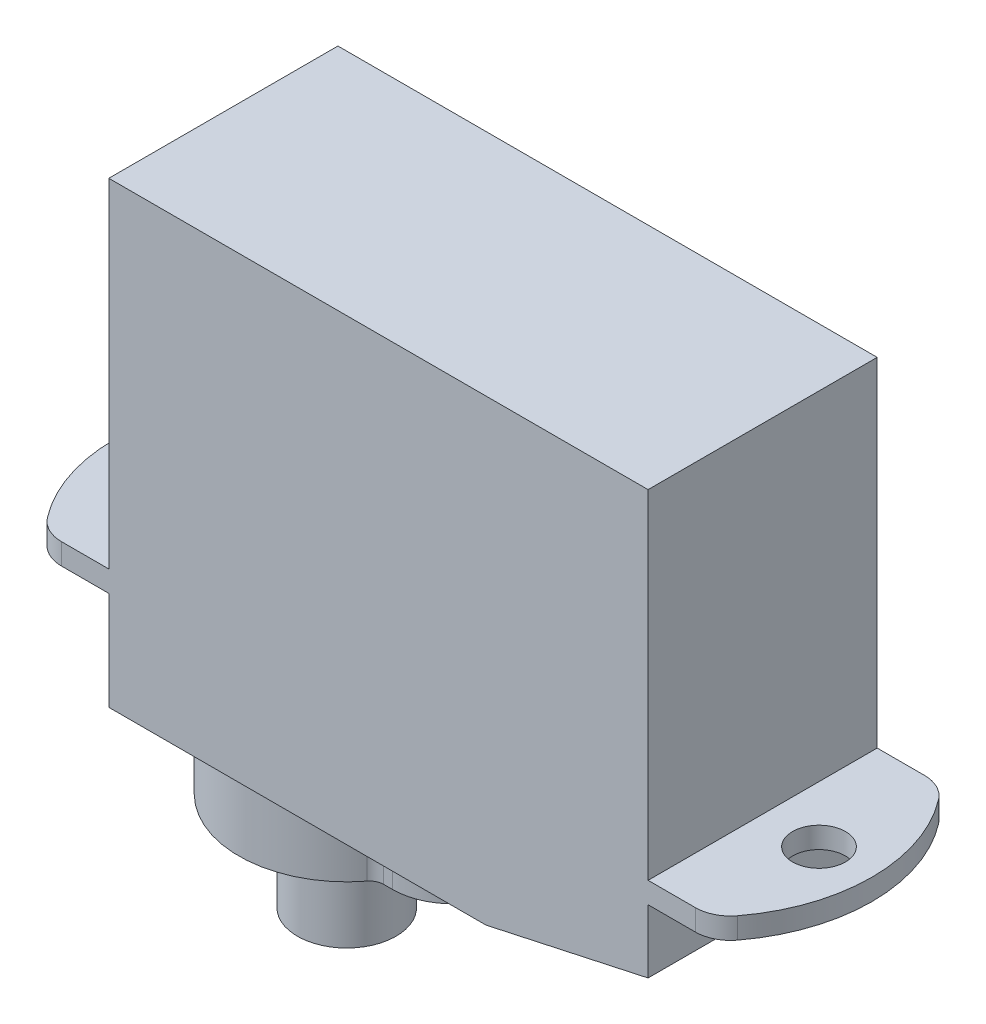
ISO-10303-21;
HEADER;
FILE_DESCRIPTION(('STEP AP214'),'2;1');
FILE_NAME('part.step','',(''),(''),'','','');
FILE_SCHEMA(('AUTOMOTIVE_DESIGN { 1 0 10303 214 1 1 1 1 }'));
ENDSEC;
DATA;
#1=APPLICATION_CONTEXT('core data for automotive mechanical design processes');
#2=APPLICATION_PROTOCOL_DEFINITION('international standard','automotive_design',2000,#1);
#3=PRODUCT_CONTEXT('',#1,'mechanical');
#4=PRODUCT('Part','Part','',(#3));
#5=PRODUCT_RELATED_PRODUCT_CATEGORY('part','',(#4));
#6=PRODUCT_DEFINITION_FORMATION('','',#4);
#7=PRODUCT_DEFINITION_CONTEXT('part definition',#1,'design');
#8=PRODUCT_DEFINITION('design','',#6,#7);
#9=PRODUCT_DEFINITION_SHAPE('','',#8);
#10=(LENGTH_UNIT() NAMED_UNIT(*) SI_UNIT(.MILLI.,.METRE.));
#11=(NAMED_UNIT(*) PLANE_ANGLE_UNIT() SI_UNIT($,.RADIAN.));
#12=(NAMED_UNIT(*) SI_UNIT($,.STERADIAN.) SOLID_ANGLE_UNIT());
#13=UNCERTAINTY_MEASURE_WITH_UNIT(LENGTH_MEASURE(1.E-05),#10,'distance_accuracy_value','');
#14=(GEOMETRIC_REPRESENTATION_CONTEXT(3) GLOBAL_UNCERTAINTY_ASSIGNED_CONTEXT((#13)) GLOBAL_UNIT_ASSIGNED_CONTEXT((#10,
#11,#12)) REPRESENTATION_CONTEXT('',''));
#15=CARTESIAN_POINT('',(0.,0.,0.));
#16=DIRECTION('',(0.,0.,1.));
#17=DIRECTION('',(1.,0.,0.));
#18=AXIS2_PLACEMENT_3D('',#15,#16,#17);
#19=CARTESIAN_POINT('',(-1.77820782436521,-2.54,-2.667));
#20=DIRECTION('',(0.,-1.,0.));
#21=DIRECTION('',(0.,0.,-1.));
#22=AXIS2_PLACEMENT_3D('',#19,#20,#21);
#23=PLANE('',#22);
#24=CARTESIAN_POINT('',(-1.77820782436521,-2.54,-2.667));
#25=DIRECTION('',(0.,1.,0.));
#26=DIRECTION('',(0.,0.,-1.));
#27=AXIS2_PLACEMENT_3D('',#24,#25,#26);
#28=CIRCLE('',#27,0.508);
#29=CARTESIAN_POINT('',(-2.18194102386056,-2.54,-2.35867630057804));
#30=VERTEX_POINT('',#29);
#31=CARTESIAN_POINT('',(-1.77820782436521,-2.54,-2.159));
#32=VERTEX_POINT('',#31);
#33=EDGE_CURVE('E199',#30,#32,#28,.T.);
#34=ORIENTED_EDGE('',*,*,#33,.T.);
#35=DIRECTION('',(1.,0.,0.));
#36=VECTOR('',#35,1.);
#37=CARTESIAN_POINT('',(-1.4605,-2.54,-2.159));
#38=LINE('',#37,#36);
#39=CARTESIAN_POINT('',(-1.4605,-2.54,-2.159));
#40=VERTEX_POINT('',#39);
#41=EDGE_CURVE('E188',#32,#40,#38,.T.);
#42=ORIENTED_EDGE('',*,*,#41,.T.);
#43=CARTESIAN_POINT('',(-1.4605,-2.54,0.));
#44=DIRECTION('',(0.,-1.,0.));
#45=DIRECTION('',(0.,0.,-1.));
#46=AXIS2_PLACEMENT_3D('',#43,#44,#45);
#47=CIRCLE('',#46,2.159);
#48=CARTESIAN_POINT('',(-1.4605,-2.54,2.159));
#49=VERTEX_POINT('',#48);
#50=EDGE_CURVE('E198',#40,#49,#47,.T.);
#51=ORIENTED_EDGE('',*,*,#50,.T.);
#52=DIRECTION('',(-1.,0.,0.));
#53=VECTOR('',#52,1.);
#54=CARTESIAN_POINT('',(-1.4605,-2.54,2.159));
#55=LINE('',#54,#53);
#56=CARTESIAN_POINT('',(-1.77820782436521,-2.54,2.159));
#57=VERTEX_POINT('',#56);
#58=EDGE_CURVE('E750',#49,#57,#55,.T.);
#59=ORIENTED_EDGE('',*,*,#58,.T.);
#60=CARTESIAN_POINT('',(-1.77820782436521,-2.54,2.667));
#61=DIRECTION('',(0.,1.,0.));
#62=DIRECTION('',(0.,0.,1.));
#63=AXIS2_PLACEMENT_3D('',#60,#61,#62);
#64=CIRCLE('',#63,0.508);
#65=CARTESIAN_POINT('',(-2.18194102386056,-2.54,2.35867630057803));
#66=VERTEX_POINT('',#65);
#67=EDGE_CURVE('E752',#57,#66,#64,.T.);
#68=ORIENTED_EDGE('',*,*,#67,.T.);
#69=CARTESIAN_POINT('',(-5.2705,-2.54,0.));
#70=DIRECTION('',(0.,-1.,0.));
#71=DIRECTION('',(0.,0.,-1.));
#72=AXIS2_PLACEMENT_3D('',#69,#70,#71);
#73=CIRCLE('',#72,3.8862);
#74=EDGE_CURVE('E204',#66,#30,#73,.T.);
#75=ORIENTED_EDGE('',*,*,#74,.T.);
#76=EDGE_LOOP('',(#34,#42,#51,#59,#68,#75));
#77=FACE_BOUND('',#76,.T.);
#78=CARTESIAN_POINT('',(-5.2705,-2.54,0.));
#79=DIRECTION('',(0.,-1.,0.));
#80=DIRECTION('',(0.,0.,-1.));
#81=AXIS2_PLACEMENT_3D('',#78,#79,#80);
#82=CIRCLE('',#81,1.778);
#83=CARTESIAN_POINT('',(-5.2705,-2.54,-1.778));
#84=VERTEX_POINT('',#83);
#85=EDGE_CURVE('E743',#84,#84,#82,.T.);
#86=ORIENTED_EDGE('',*,*,#85,.F.);
#87=EDGE_LOOP('',(#86));
#88=FACE_BOUND('',#87,.T.);
#89=ADVANCED_FACE('F33',(#77,#88),#23,.T.);
#90=CARTESIAN_POINT('',(0.,0.,0.));
#91=DIRECTION('',(0.,1.,0.));
#92=DIRECTION('',(0.,0.,1.));
#93=AXIS2_PLACEMENT_3D('',#90,#91,#92);
#94=PLANE('',#93);
#95=DIRECTION('',(-1.,0.,0.));
#96=VECTOR('',#95,1.);
#97=CARTESIAN_POINT('',(9.7155,0.,-4.1275));
#98=LINE('',#97,#96);
#99=CARTESIAN_POINT('',(3.87350000000001,0.,-4.1275025));
#100=VERTEX_POINT('',#99);
#101=CARTESIAN_POINT('',(-9.7155,0.,-4.1275));
#102=VERTEX_POINT('',#101);
#103=EDGE_CURVE('E37',#100,#102,#98,.T.);
#104=ORIENTED_EDGE('',*,*,#103,.F.);
#105=DIRECTION('',(0.,0.,1.));
#106=VECTOR('',#105,1.);
#107=CARTESIAN_POINT('',(3.8735,0.,0.));
#108=LINE('',#107,#106);
#109=CARTESIAN_POINT('',(3.8735,0.,4.1275));
#110=VERTEX_POINT('',#109);
#111=EDGE_CURVE('E11',#100,#110,#108,.T.);
#112=ORIENTED_EDGE('',*,*,#111,.T.);
#113=DIRECTION('',(1.,0.,0.));
#114=VECTOR('',#113,1.);
#115=CARTESIAN_POINT('',(9.7155,0.,4.1275));
#116=LINE('',#115,#114);
#117=CARTESIAN_POINT('',(-9.7155,0.,4.1275));
#118=VERTEX_POINT('',#117);
#119=EDGE_CURVE('E330',#118,#110,#116,.T.);
#120=ORIENTED_EDGE('',*,*,#119,.F.);
#121=DIRECTION('',(0.,0.,1.));
#122=VECTOR('',#121,1.);
#123=CARTESIAN_POINT('',(-9.7155,0.,4.1275));
#124=LINE('',#123,#122);
#125=EDGE_CURVE('E312',#102,#118,#124,.T.);
#126=ORIENTED_EDGE('',*,*,#125,.F.);
#127=EDGE_LOOP('',(#104,#112,#120,#126));
#128=FACE_BOUND('',#127,.T.);
#129=CARTESIAN_POINT('',(-1.77820782436521,0.,-2.667));
#130=DIRECTION('',(0.,1.,0.));
#131=DIRECTION('',(0.,0.,-1.));
#132=AXIS2_PLACEMENT_3D('',#129,#130,#131);
#133=CIRCLE('',#132,0.508);
#134=CARTESIAN_POINT('',(-2.18194102386056,0.,-2.35867630057804));
#135=VERTEX_POINT('',#134);
#136=CARTESIAN_POINT('',(-1.77820782436521,0.,-2.159));
#137=VERTEX_POINT('',#136);
#138=EDGE_CURVE('E211',#135,#137,#133,.T.);
#139=ORIENTED_EDGE('',*,*,#138,.F.);
#140=CARTESIAN_POINT('',(-5.2705,0.,0.));
#141=DIRECTION('',(0.,-1.,0.));
#142=DIRECTION('',(0.,0.,-1.));
#143=AXIS2_PLACEMENT_3D('',#140,#141,#142);
#144=CIRCLE('',#143,3.8862);
#145=CARTESIAN_POINT('',(-2.18194102386056,0.,2.35867630057803));
#146=VERTEX_POINT('',#145);
#147=EDGE_CURVE('E208',#146,#135,#144,.T.);
#148=ORIENTED_EDGE('',*,*,#147,.F.);
#149=CARTESIAN_POINT('',(-1.77820782436521,0.,2.667));
#150=DIRECTION('',(0.,1.,0.));
#151=DIRECTION('',(0.,0.,1.));
#152=AXIS2_PLACEMENT_3D('',#149,#150,#151);
#153=CIRCLE('',#152,0.508);
#154=CARTESIAN_POINT('',(-1.77820782436521,0.,2.159));
#155=VERTEX_POINT('',#154);
#156=EDGE_CURVE('E761',#155,#146,#153,.T.);
#157=ORIENTED_EDGE('',*,*,#156,.F.);
#158=DIRECTION('',(-1.,0.,0.));
#159=VECTOR('',#158,1.);
#160=CARTESIAN_POINT('',(-1.4605,0.,2.159));
#161=LINE('',#160,#159);
#162=CARTESIAN_POINT('',(-1.4605,0.,2.159));
#163=VERTEX_POINT('',#162);
#164=EDGE_CURVE('E758',#163,#155,#161,.T.);
#165=ORIENTED_EDGE('',*,*,#164,.F.);
#166=CARTESIAN_POINT('',(-1.4605,0.,0.));
#167=DIRECTION('',(0.,-1.,0.));
#168=DIRECTION('',(0.,0.,-1.));
#169=AXIS2_PLACEMENT_3D('',#166,#167,#168);
#170=CIRCLE('',#169,2.159);
#171=CARTESIAN_POINT('',(-1.4605,0.,-2.159));
#172=VERTEX_POINT('',#171);
#173=EDGE_CURVE('E56',#172,#163,#170,.T.);
#174=ORIENTED_EDGE('',*,*,#173,.F.);
#175=DIRECTION('',(1.,0.,0.));
#176=VECTOR('',#175,1.);
#177=CARTESIAN_POINT('',(-1.4605,0.,-2.159));
#178=LINE('',#177,#176);
#179=EDGE_CURVE('E51',#137,#172,#178,.T.);
#180=ORIENTED_EDGE('',*,*,#179,.F.);
#181=EDGE_LOOP('',(#139,#148,#157,#165,#174,#180));
#182=FACE_BOUND('',#181,.T.);
#183=ADVANCED_FACE('F377',(#128,#182),#94,.F.);
#184=CARTESIAN_POINT('',(-9.7155,16.51,4.1275));
#185=DIRECTION('',(1.,0.,0.));
#186=DIRECTION('',(0.,0.,-1.));
#187=AXIS2_PLACEMENT_3D('',#184,#185,#186);
#188=PLANE('',#187);
#189=DIRECTION('',(0.,0.,-1.));
#190=VECTOR('',#189,1.);
#191=CARTESIAN_POINT('',(-9.7155,4.318,-4.1275));
#192=LINE('',#191,#190);
#193=CARTESIAN_POINT('',(-9.7155,4.318,4.1275));
#194=VERTEX_POINT('',#193);
#195=CARTESIAN_POINT('',(-9.7155,4.318,-4.1275));
#196=VERTEX_POINT('',#195);
#197=EDGE_CURVE('E237',#194,#196,#192,.T.);
#198=ORIENTED_EDGE('',*,*,#197,.F.);
#199=DIRECTION('',(0.,-1.,0.));
#200=VECTOR('',#199,1.);
#201=CARTESIAN_POINT('',(-9.7155,16.51,4.1275));
#202=LINE('',#201,#200);
#203=CARTESIAN_POINT('',(-9.7155,16.51,4.1275));
#204=VERTEX_POINT('',#203);
#205=EDGE_CURVE('E43',#204,#194,#202,.T.);
#206=ORIENTED_EDGE('',*,*,#205,.F.);
#207=DIRECTION('',(0.,0.,1.));
#208=VECTOR('',#207,1.);
#209=CARTESIAN_POINT('',(-9.7155,16.51,4.1275));
#210=LINE('',#209,#208);
#211=CARTESIAN_POINT('',(-9.7155,16.51,-4.1275));
#212=VERTEX_POINT('',#211);
#213=EDGE_CURVE('E318',#212,#204,#210,.T.);
#214=ORIENTED_EDGE('',*,*,#213,.F.);
#215=DIRECTION('',(0.,-1.,0.));
#216=VECTOR('',#215,1.);
#217=CARTESIAN_POINT('',(-9.7155,16.51,-4.1275));
#218=LINE('',#217,#216);
#219=EDGE_CURVE('E341',#212,#196,#218,.T.);
#220=ORIENTED_EDGE('',*,*,#219,.T.);
#221=EDGE_LOOP('',(#198,#206,#214,#220));
#222=FACE_BOUND('',#221,.T.);
#223=ADVANCED_FACE('F416',(#222),#188,.F.);
#224=CARTESIAN_POINT('',(9.7155,16.51,4.1275));
#225=DIRECTION('',(-1.,0.,0.));
#226=DIRECTION('',(0.,0.,1.));
#227=AXIS2_PLACEMENT_3D('',#224,#225,#226);
#228=PLANE('',#227);
#229=DIRECTION('',(0.,0.,1.));
#230=VECTOR('',#229,1.);
#231=CARTESIAN_POINT('',(9.7155,4.318,4.1275));
#232=LINE('',#231,#230);
#233=CARTESIAN_POINT('',(9.7155,4.318,-4.1275));
#234=VERTEX_POINT('',#233);
#235=CARTESIAN_POINT('',(9.7155,4.318,4.1275));
#236=VERTEX_POINT('',#235);
#237=EDGE_CURVE('E292',#234,#236,#232,.T.);
#238=ORIENTED_EDGE('',*,*,#237,.F.);
#239=DIRECTION('',(0.,-1.,0.));
#240=VECTOR('',#239,1.);
#241=CARTESIAN_POINT('',(9.7155,16.51,-4.1275));
#242=LINE('',#241,#240);
#243=CARTESIAN_POINT('',(9.7155,16.51,-4.1275));
#244=VERTEX_POINT('',#243);
#245=EDGE_CURVE('E352',#244,#234,#242,.T.);
#246=ORIENTED_EDGE('',*,*,#245,.F.);
#247=DIRECTION('',(0.,0.,-1.));
#248=VECTOR('',#247,1.);
#249=CARTESIAN_POINT('',(9.7155,16.51,4.1275));
#250=LINE('',#249,#248);
#251=CARTESIAN_POINT('',(9.7155,16.51,4.1275));
#252=VERTEX_POINT('',#251);
#253=EDGE_CURVE('E323',#252,#244,#250,.T.);
#254=ORIENTED_EDGE('',*,*,#253,.F.);
#255=DIRECTION('',(0.,-1.,0.));
#256=VECTOR('',#255,1.);
#257=CARTESIAN_POINT('',(9.7155,16.51,4.1275));
#258=LINE('',#257,#256);
#259=EDGE_CURVE('E348',#252,#236,#258,.T.);
#260=ORIENTED_EDGE('',*,*,#259,.T.);
#261=EDGE_LOOP('',(#238,#246,#254,#260));
#262=FACE_BOUND('',#261,.T.);
#263=ADVANCED_FACE('F666',(#262),#228,.F.);
#264=CARTESIAN_POINT('',(-9.7155,3.556,4.1275));
#265=VERTEX_POINT('',#264);
#266=EDGE_CURVE('E345',#265,#118,#202,.T.);
#267=ORIENTED_EDGE('',*,*,#266,.F.);
#268=DIRECTION('',(0.,0.,-1.));
#269=VECTOR('',#268,1.);
#270=CARTESIAN_POINT('',(-9.7155,3.556,-4.1275));
#271=LINE('',#270,#269);
#272=CARTESIAN_POINT('',(-9.7155,3.556,-4.1275));
#273=VERTEX_POINT('',#272);
#274=EDGE_CURVE('E259',#265,#273,#271,.T.);
#275=ORIENTED_EDGE('',*,*,#274,.T.);
#276=EDGE_CURVE('E327',#273,#102,#218,.T.);
#277=ORIENTED_EDGE('',*,*,#276,.T.);
#278=ORIENTED_EDGE('',*,*,#125,.T.);
#279=EDGE_LOOP('',(#267,#275,#277,#278));
#280=FACE_BOUND('',#279,.T.);
#281=ADVANCED_FACE('F35',(#280),#188,.F.);
#282=CARTESIAN_POINT('',(9.7155,16.51,4.1275));
#283=DIRECTION('',(0.,0.,-1.));
#284=DIRECTION('',(-1.,0.,0.));
#285=AXIS2_PLACEMENT_3D('',#282,#283,#284);
#286=PLANE('',#285);
#287=ORIENTED_EDGE('',*,*,#119,.T.);
#288=DIRECTION('',(-0.977176363922801,-0.212429644331044,0.));
#289=VECTOR('',#288,1.);
#290=CARTESIAN_POINT('',(9.7155,1.27,4.1275));
#291=LINE('',#290,#289);
#292=CARTESIAN_POINT('',(9.7155,1.27,4.1275));
#293=VERTEX_POINT('',#292);
#294=EDGE_CURVE('E212',#293,#110,#291,.T.);
#295=ORIENTED_EDGE('',*,*,#294,.F.);
#296=CARTESIAN_POINT('',(9.7155,3.556,4.1275));
#297=VERTEX_POINT('',#296);
#298=EDGE_CURVE('E287',#297,#293,#258,.T.);
#299=ORIENTED_EDGE('',*,*,#298,.F.);
#300=DIRECTION('',(1.,0.,0.));
#301=VECTOR('',#300,1.);
#302=CARTESIAN_POINT('',(9.7155,3.556,4.1275));
#303=LINE('',#302,#301);
#304=CARTESIAN_POINT('',(11.4179236568572,3.556,4.1275));
#305=VERTEX_POINT('',#304);
#306=EDGE_CURVE('E270',#297,#305,#303,.T.);
#307=ORIENTED_EDGE('',*,*,#306,.T.);
#308=DIRECTION('',(0.,1.,0.));
#309=VECTOR('',#308,1.);
#310=CARTESIAN_POINT('',(11.4179236568572,3.556,4.1275));
#311=LINE('',#310,#309);
#312=CARTESIAN_POINT('',(11.4179236568572,4.318,4.1275));
#313=VERTEX_POINT('',#312);
#314=EDGE_CURVE('E286',#305,#313,#311,.T.);
#315=ORIENTED_EDGE('',*,*,#314,.T.);
#316=DIRECTION('',(1.,0.,0.));
#317=VECTOR('',#316,1.);
#318=CARTESIAN_POINT('',(9.7155,4.318,4.1275));
#319=LINE('',#318,#317);
#320=EDGE_CURVE('E263',#236,#313,#319,.T.);
#321=ORIENTED_EDGE('',*,*,#320,.F.);
#322=ORIENTED_EDGE('',*,*,#259,.F.);
#323=DIRECTION('',(1.,0.,0.));
#324=VECTOR('',#323,1.);
#325=CARTESIAN_POINT('',(9.7155,16.51,4.1275));
#326=LINE('',#325,#324);
#327=EDGE_CURVE('E321',#204,#252,#326,.T.);
#328=ORIENTED_EDGE('',*,*,#327,.F.);
#329=ORIENTED_EDGE('',*,*,#205,.T.);
#330=DIRECTION('',(1.,0.,0.));
#331=VECTOR('',#330,1.);
#332=CARTESIAN_POINT('',(-9.7155,4.318,4.1275));
#333=LINE('',#332,#331);
#334=CARTESIAN_POINT('',(-11.4179236568572,4.318,4.1275));
#335=VERTEX_POINT('',#334);
#336=EDGE_CURVE('E242',#335,#194,#333,.T.);
#337=ORIENTED_EDGE('',*,*,#336,.F.);
#338=DIRECTION('',(0.,1.,0.));
#339=VECTOR('',#338,1.);
#340=CARTESIAN_POINT('',(-11.4179236568572,3.556,4.1275));
#341=LINE('',#340,#339);
#342=CARTESIAN_POINT('',(-11.4179236568572,3.556,4.1275));
#343=VERTEX_POINT('',#342);
#344=EDGE_CURVE('E250',#343,#335,#341,.T.);
#345=ORIENTED_EDGE('',*,*,#344,.F.);
#346=DIRECTION('',(1.,0.,0.));
#347=VECTOR('',#346,1.);
#348=CARTESIAN_POINT('',(-9.7155,3.556,4.1275));
#349=LINE('',#348,#347);
#350=EDGE_CURVE('E390',#343,#265,#349,.T.);
#351=ORIENTED_EDGE('',*,*,#350,.T.);
#352=ORIENTED_EDGE('',*,*,#266,.T.);
#353=EDGE_LOOP('',(#287,#295,#299,#307,#315,#321,#322,#328,#329,#337,#345,#351,#352));
#354=FACE_BOUND('',#353,.T.);
#355=ADVANCED_FACE('F371',(#354),#286,.F.);
#356=ORIENTED_EDGE('',*,*,#298,.T.);
#357=DIRECTION('',(0.,0.,1.));
#358=VECTOR('',#357,1.);
#359=CARTESIAN_POINT('',(9.7155,1.27,-4.12755));
#360=LINE('',#359,#358);
#361=CARTESIAN_POINT('',(9.7155,1.27,-4.1275));
#362=VERTEX_POINT('',#361);
#363=EDGE_CURVE('E214',#362,#293,#360,.T.);
#364=ORIENTED_EDGE('',*,*,#363,.F.);
#365=CARTESIAN_POINT('',(9.7155,3.556,-4.1275));
#366=VERTEX_POINT('',#365);
#367=EDGE_CURVE('E344',#366,#362,#242,.T.);
#368=ORIENTED_EDGE('',*,*,#367,.F.);
#369=DIRECTION('',(0.,0.,1.));
#370=VECTOR('',#369,1.);
#371=CARTESIAN_POINT('',(9.7155,3.556,4.1275));
#372=LINE('',#371,#370);
#373=EDGE_CURVE('E282',#366,#297,#372,.T.);
#374=ORIENTED_EDGE('',*,*,#373,.T.);
#375=EDGE_LOOP('',(#356,#364,#368,#374));
#376=FACE_BOUND('',#375,.T.);
#377=ADVANCED_FACE('F366',(#376),#228,.F.);
#378=CARTESIAN_POINT('',(9.7155,16.51,-4.1275));
#379=DIRECTION('',(0.,0.,1.));
#380=DIRECTION('',(1.,0.,0.));
#381=AXIS2_PLACEMENT_3D('',#378,#379,#380);
#382=PLANE('',#381);
#383=ORIENTED_EDGE('',*,*,#367,.T.);
#384=DIRECTION('',(-0.977176363922801,-0.212429644331044,0.));
#385=VECTOR('',#384,1.);
#386=CARTESIAN_POINT('',(12.8790379061372,1.95772563176896,-4.1275));
#387=LINE('',#386,#385);
#388=EDGE_CURVE('E221',#362,#100,#387,.T.);
#389=ORIENTED_EDGE('',*,*,#388,.T.);
#390=ORIENTED_EDGE('',*,*,#103,.T.);
#391=ORIENTED_EDGE('',*,*,#276,.F.);
#392=DIRECTION('',(-1.,0.,0.));
#393=VECTOR('',#392,1.);
#394=CARTESIAN_POINT('',(-9.7155,3.556,-4.1275));
#395=LINE('',#394,#393);
#396=CARTESIAN_POINT('',(-11.4179236568572,3.556,-4.1275));
#397=VERTEX_POINT('',#396);
#398=EDGE_CURVE('E241',#273,#397,#395,.T.);
#399=ORIENTED_EDGE('',*,*,#398,.T.);
#400=DIRECTION('',(0.,1.,0.));
#401=VECTOR('',#400,1.);
#402=CARTESIAN_POINT('',(-11.4179236568572,3.556,-4.1275));
#403=LINE('',#402,#401);
#404=CARTESIAN_POINT('',(-11.4179236568572,4.318,-4.1275));
#405=VERTEX_POINT('',#404);
#406=EDGE_CURVE('E257',#397,#405,#403,.T.);
#407=ORIENTED_EDGE('',*,*,#406,.T.);
#408=DIRECTION('',(-1.,0.,0.));
#409=VECTOR('',#408,1.);
#410=CARTESIAN_POINT('',(-9.7155,4.318,-4.1275));
#411=LINE('',#410,#409);
#412=EDGE_CURVE('E233',#196,#405,#411,.T.);
#413=ORIENTED_EDGE('',*,*,#412,.F.);
#414=ORIENTED_EDGE('',*,*,#219,.F.);
#415=DIRECTION('',(-1.,0.,0.));
#416=VECTOR('',#415,1.);
#417=CARTESIAN_POINT('',(9.7155,16.51,-4.1275));
#418=LINE('',#417,#416);
#419=EDGE_CURVE('E325',#244,#212,#418,.T.);
#420=ORIENTED_EDGE('',*,*,#419,.F.);
#421=ORIENTED_EDGE('',*,*,#245,.T.);
#422=DIRECTION('',(-1.,0.,0.));
#423=VECTOR('',#422,1.);
#424=CARTESIAN_POINT('',(9.7155,4.318,-4.1275));
#425=LINE('',#424,#423);
#426=CARTESIAN_POINT('',(11.4179236568572,4.318,-4.1275));
#427=VERTEX_POINT('',#426);
#428=EDGE_CURVE('E298',#427,#234,#425,.T.);
#429=ORIENTED_EDGE('',*,*,#428,.F.);
#430=DIRECTION('',(0.,1.,0.));
#431=VECTOR('',#430,1.);
#432=CARTESIAN_POINT('',(11.4179236568572,3.556,-4.1275));
#433=LINE('',#432,#431);
#434=CARTESIAN_POINT('',(11.4179236568572,3.556,-4.1275));
#435=VERTEX_POINT('',#434);
#436=EDGE_CURVE('E310',#435,#427,#433,.T.);
#437=ORIENTED_EDGE('',*,*,#436,.F.);
#438=DIRECTION('',(-1.,0.,0.));
#439=VECTOR('',#438,1.);
#440=CARTESIAN_POINT('',(9.7155,3.556,-4.1275));
#441=LINE('',#440,#439);
#442=EDGE_CURVE('E276',#435,#366,#441,.T.);
#443=ORIENTED_EDGE('',*,*,#442,.T.);
#444=EDGE_LOOP('',(#383,#389,#390,#391,#399,#407,#413,#414,#420,#421,#429,#437,#443));
#445=FACE_BOUND('',#444,.T.);
#446=ADVANCED_FACE('F382',(#445),#382,.F.);
#447=CARTESIAN_POINT('',(0.,16.51,0.));
#448=DIRECTION('',(0.,1.,0.));
#449=DIRECTION('',(0.,0.,1.));
#450=AXIS2_PLACEMENT_3D('',#447,#448,#449);
#451=PLANE('',#450);
#452=ORIENTED_EDGE('',*,*,#213,.T.);
#453=ORIENTED_EDGE('',*,*,#327,.T.);
#454=ORIENTED_EDGE('',*,*,#253,.T.);
#455=ORIENTED_EDGE('',*,*,#419,.T.);
#456=EDGE_LOOP('',(#452,#453,#454,#455));
#457=FACE_BOUND('',#456,.T.);
#458=ADVANCED_FACE('F420',(#457),#451,.T.);
#459=CARTESIAN_POINT('',(11.4179236568572,3.556,-2.8575));
#460=DIRECTION('',(0.,1.,0.));
#461=DIRECTION('',(0.,0.,1.));
#462=AXIS2_PLACEMENT_3D('',#459,#460,#461);
#463=CYLINDRICAL_SURFACE('',#462,1.27);
#464=CARTESIAN_POINT('',(11.4179236568572,4.318,-2.8575));
#465=DIRECTION('',(0.,1.,0.));
#466=DIRECTION('',(0.,0.,-1.));
#467=AXIS2_PLACEMENT_3D('',#464,#465,#466);
#468=CIRCLE('',#467,1.27);
#469=CARTESIAN_POINT('',(12.4281051132497,4.318,-3.62719696969697));
#470=VERTEX_POINT('',#469);
#471=EDGE_CURVE('E300',#470,#427,#468,.T.);
#472=ORIENTED_EDGE('',*,*,#471,.F.);
#473=DIRECTION('',(0.,1.,0.));
#474=VECTOR('',#473,1.);
#475=CARTESIAN_POINT('',(12.4281051132497,3.556,-3.62719696969697));
#476=LINE('',#475,#474);
#477=CARTESIAN_POINT('',(12.4281051132497,3.556,-3.62719696969697));
#478=VERTEX_POINT('',#477);
#479=EDGE_CURVE('E313',#478,#470,#476,.T.);
#480=ORIENTED_EDGE('',*,*,#479,.F.);
#481=CARTESIAN_POINT('',(11.4179236568572,3.556,-2.8575));
#482=DIRECTION('',(0.,1.,0.));
#483=DIRECTION('',(0.,0.,-1.));
#484=AXIS2_PLACEMENT_3D('',#481,#482,#483);
#485=CIRCLE('',#484,1.27);
#486=EDGE_CURVE('E273',#478,#435,#485,.T.);
#487=ORIENTED_EDGE('',*,*,#486,.T.);
#488=ORIENTED_EDGE('',*,*,#436,.T.);
#489=EDGE_LOOP('',(#472,#480,#487,#488));
#490=FACE_BOUND('',#489,.T.);
#491=ADVANCED_FACE('F636',(#490),#463,.T.);
#492=CARTESIAN_POINT('',(7.667625,3.556,0.));
#493=DIRECTION('',(0.,1.,0.));
#494=DIRECTION('',(0.,0.,1.));
#495=AXIS2_PLACEMENT_3D('',#492,#493,#494);
#496=CYLINDRICAL_SURFACE('',#495,5.984875);
#497=CARTESIAN_POINT('',(7.667625,4.318,0.));
#498=DIRECTION('',(0.,1.,0.));
#499=DIRECTION('',(0.,0.,-1.));
#500=AXIS2_PLACEMENT_3D('',#497,#498,#499);
#501=CIRCLE('',#500,5.984875);
#502=CARTESIAN_POINT('',(12.4281051132497,4.318,3.62719696969697));
#503=VERTEX_POINT('',#502);
#504=EDGE_CURVE('E731',#503,#470,#501,.T.);
#505=ORIENTED_EDGE('',*,*,#504,.F.);
#506=DIRECTION('',(0.,1.,0.));
#507=VECTOR('',#506,1.);
#508=CARTESIAN_POINT('',(12.4281051132497,3.556,3.62719696969697));
#509=LINE('',#508,#507);
#510=CARTESIAN_POINT('',(12.4281051132497,3.556,3.62719696969697));
#511=VERTEX_POINT('',#510);
#512=EDGE_CURVE('E315',#511,#503,#509,.T.);
#513=ORIENTED_EDGE('',*,*,#512,.F.);
#514=CARTESIAN_POINT('',(7.667625,3.556,0.));
#515=DIRECTION('',(0.,1.,0.));
#516=DIRECTION('',(0.,0.,-1.));
#517=AXIS2_PLACEMENT_3D('',#514,#515,#516);
#518=CIRCLE('',#517,5.984875);
#519=EDGE_CURVE('E269',#511,#478,#518,.T.);
#520=ORIENTED_EDGE('',*,*,#519,.T.);
#521=ORIENTED_EDGE('',*,*,#479,.T.);
#522=EDGE_LOOP('',(#505,#513,#520,#521));
#523=FACE_BOUND('',#522,.T.);
#524=ADVANCED_FACE('F627',(#523),#496,.T.);
#525=CARTESIAN_POINT('',(11.4179236568572,3.556,2.8575));
#526=DIRECTION('',(0.,1.,0.));
#527=DIRECTION('',(0.,0.,1.));
#528=AXIS2_PLACEMENT_3D('',#525,#526,#527);
#529=CYLINDRICAL_SURFACE('',#528,1.27);
#530=CARTESIAN_POINT('',(11.4179236568572,4.318,2.8575));
#531=DIRECTION('',(0.,1.,0.));
#532=DIRECTION('',(0.,0.,1.));
#533=AXIS2_PLACEMENT_3D('',#530,#531,#532);
#534=CIRCLE('',#533,1.27);
#535=EDGE_CURVE('E279',#313,#503,#534,.T.);
#536=ORIENTED_EDGE('',*,*,#535,.F.);
#537=ORIENTED_EDGE('',*,*,#314,.F.);
#538=CARTESIAN_POINT('',(11.4179236568572,3.556,2.8575));
#539=DIRECTION('',(0.,1.,0.));
#540=DIRECTION('',(0.,0.,1.));
#541=AXIS2_PLACEMENT_3D('',#538,#539,#540);
#542=CIRCLE('',#541,1.27);
#543=EDGE_CURVE('E266',#305,#511,#542,.T.);
#544=ORIENTED_EDGE('',*,*,#543,.T.);
#545=ORIENTED_EDGE('',*,*,#512,.T.);
#546=EDGE_LOOP('',(#536,#537,#544,#545));
#547=FACE_BOUND('',#546,.T.);
#548=ADVANCED_FACE('F618',(#547),#529,.T.);
#549=CARTESIAN_POINT('',(11.4179236568572,3.556,2.8575));
#550=DIRECTION('',(0.,1.,0.));
#551=DIRECTION('',(0.,0.,1.));
#552=AXIS2_PLACEMENT_3D('',#549,#550,#551);
#553=PLANE('',#552);
#554=CARTESIAN_POINT('',(11.7475,3.556,0.));
#555=DIRECTION('',(0.,1.,0.));
#556=DIRECTION('',(0.,0.,1.));
#557=AXIS2_PLACEMENT_3D('',#554,#555,#556);
#558=CIRCLE('',#557,0.9525);
#559=CARTESIAN_POINT('',(11.7475,3.556,0.952500000000001));
#560=VERTEX_POINT('',#559);
#561=EDGE_CURVE('E260',#560,#560,#558,.T.);
#562=ORIENTED_EDGE('',*,*,#561,.T.);
#563=EDGE_LOOP('',(#562));
#564=FACE_BOUND('',#563,.T.);
#565=ORIENTED_EDGE('',*,*,#306,.F.);
#566=ORIENTED_EDGE('',*,*,#373,.F.);
#567=ORIENTED_EDGE('',*,*,#442,.F.);
#568=ORIENTED_EDGE('',*,*,#486,.F.);
#569=ORIENTED_EDGE('',*,*,#519,.F.);
#570=ORIENTED_EDGE('',*,*,#543,.F.);
#571=EDGE_LOOP('',(#565,#566,#567,#568,#569,#570));
#572=FACE_BOUND('',#571,.T.);
#573=ADVANCED_FACE('F609',(#564,#572),#553,.F.);
#574=CARTESIAN_POINT('',(11.4179236568572,4.318,2.8575));
#575=DIRECTION('',(0.,1.,0.));
#576=DIRECTION('',(0.,0.,1.));
#577=AXIS2_PLACEMENT_3D('',#574,#575,#576);
#578=PLANE('',#577);
#579=CARTESIAN_POINT('',(11.7475,4.318,0.));
#580=DIRECTION('',(0.,1.,0.));
#581=DIRECTION('',(0.,0.,1.));
#582=AXIS2_PLACEMENT_3D('',#579,#580,#581);
#583=CIRCLE('',#582,0.9525);
#584=CARTESIAN_POINT('',(11.7475,4.318,0.952500000000001));
#585=VERTEX_POINT('',#584);
#586=EDGE_CURVE('E252',#585,#585,#583,.T.);
#587=ORIENTED_EDGE('',*,*,#586,.F.);
#588=EDGE_LOOP('',(#587));
#589=FACE_BOUND('',#588,.T.);
#590=ORIENTED_EDGE('',*,*,#320,.T.);
#591=ORIENTED_EDGE('',*,*,#535,.T.);
#592=ORIENTED_EDGE('',*,*,#504,.T.);
#593=ORIENTED_EDGE('',*,*,#471,.T.);
#594=ORIENTED_EDGE('',*,*,#428,.T.);
#595=ORIENTED_EDGE('',*,*,#237,.T.);
#596=EDGE_LOOP('',(#590,#591,#592,#593,#594,#595));
#597=FACE_BOUND('',#596,.T.);
#598=ADVANCED_FACE('F600',(#589,#597),#578,.T.);
#599=CARTESIAN_POINT('',(11.7475,3.556,0.));
#600=DIRECTION('',(0.,1.,0.));
#601=DIRECTION('',(0.,0.,1.));
#602=AXIS2_PLACEMENT_3D('',#599,#600,#601);
#603=CYLINDRICAL_SURFACE('',#602,0.9525);
#604=CARTESIAN_POINT('',(11.7475,3.556,0.952500000000001));
#605=CARTESIAN_POINT('',(11.7475,3.5639375,0.952500000000001));
#606=CARTESIAN_POINT('',(11.7475,3.571875,0.952500000000001));
#607=CARTESIAN_POINT('',(11.7475,3.58775,0.952500000000001));
#608=CARTESIAN_POINT('',(11.7475,3.5956875,0.952500000000001));
#609=CARTESIAN_POINT('',(11.7475,3.6115625,0.952500000000001));
#610=CARTESIAN_POINT('',(11.7475,3.6195,0.952500000000001));
#611=CARTESIAN_POINT('',(11.7475,3.635375,0.952500000000001));
#612=CARTESIAN_POINT('',(11.7475,3.6433125,0.952500000000001));
#613=CARTESIAN_POINT('',(11.7475,3.6591875,0.952500000000001));
#614=CARTESIAN_POINT('',(11.7475,3.667125,0.952500000000001));
#615=CARTESIAN_POINT('',(11.7475,3.683,0.952500000000001));
#616=CARTESIAN_POINT('',(11.7475,3.6909375,0.952500000000001));
#617=CARTESIAN_POINT('',(11.7475,3.7068125,0.952500000000001));
#618=CARTESIAN_POINT('',(11.7475,3.71475,0.952500000000001));
#619=CARTESIAN_POINT('',(11.7475,3.730625,0.952500000000001));
#620=CARTESIAN_POINT('',(11.7475,3.7385625,0.952500000000001));
#621=CARTESIAN_POINT('',(11.7475,3.7544375,0.952500000000001));
#622=CARTESIAN_POINT('',(11.7475,3.762375,0.952500000000001));
#623=CARTESIAN_POINT('',(11.7475,3.77825,0.952500000000001));
#624=CARTESIAN_POINT('',(11.7475,3.7861875,0.952500000000001));
#625=CARTESIAN_POINT('',(11.7475,3.8020625,0.952500000000001));
#626=CARTESIAN_POINT('',(11.7475,3.81,0.952500000000001));
#627=CARTESIAN_POINT('',(11.7475,3.825875,0.952500000000001));
#628=CARTESIAN_POINT('',(11.7475,3.8338125,0.952500000000001));
#629=CARTESIAN_POINT('',(11.7475,3.8496875,0.952500000000001));
#630=CARTESIAN_POINT('',(11.7475,3.857625,0.952500000000001));
#631=CARTESIAN_POINT('',(11.7475,3.8735,0.952500000000001));
#632=CARTESIAN_POINT('',(11.7475,3.8814375,0.952500000000001));
#633=CARTESIAN_POINT('',(11.7475,3.8973125,0.952500000000001));
#634=CARTESIAN_POINT('',(11.7475,3.90525,0.952500000000001));
#635=CARTESIAN_POINT('',(11.7475,3.921125,0.952500000000001));
#636=CARTESIAN_POINT('',(11.7475,3.9290625,0.952500000000001));
#637=CARTESIAN_POINT('',(11.7475,3.9449375,0.952500000000001));
#638=CARTESIAN_POINT('',(11.7475,3.952875,0.952500000000001));
#639=CARTESIAN_POINT('',(11.7475,3.96875,0.952500000000001));
#640=CARTESIAN_POINT('',(11.7475,3.9766875,0.952500000000001));
#641=CARTESIAN_POINT('',(11.7475,3.9925625,0.952500000000001));
#642=CARTESIAN_POINT('',(11.7475,4.0005,0.952500000000001));
#643=CARTESIAN_POINT('',(11.7475,4.016375,0.952500000000001));
#644=CARTESIAN_POINT('',(11.7475,4.0243125,0.952500000000001));
#645=CARTESIAN_POINT('',(11.7475,4.0401875,0.952500000000001));
#646=CARTESIAN_POINT('',(11.7475,4.048125,0.952500000000001));
#647=CARTESIAN_POINT('',(11.7475,4.064,0.952500000000001));
#648=CARTESIAN_POINT('',(11.7475,4.0719375,0.952500000000001));
#649=CARTESIAN_POINT('',(11.7475,4.0878125,0.952500000000001));
#650=CARTESIAN_POINT('',(11.7475,4.09575,0.952500000000001));
#651=CARTESIAN_POINT('',(11.7475,4.111625,0.952500000000001));
#652=CARTESIAN_POINT('',(11.7475,4.1195625,0.952500000000001));
#653=CARTESIAN_POINT('',(11.7475,4.1354375,0.952500000000001));
#654=CARTESIAN_POINT('',(11.7475,4.143375,0.952500000000001));
#655=CARTESIAN_POINT('',(11.7475,4.15925,0.952500000000001));
#656=CARTESIAN_POINT('',(11.7475,4.1671875,0.952500000000001));
#657=CARTESIAN_POINT('',(11.7475,4.1830625,0.952500000000001));
#658=CARTESIAN_POINT('',(11.7475,4.191,0.952500000000001));
#659=CARTESIAN_POINT('',(11.7475,4.206875,0.952500000000001));
#660=CARTESIAN_POINT('',(11.7475,4.2148125,0.952500000000001));
#661=CARTESIAN_POINT('',(11.7475,4.2306875,0.952500000000001));
#662=CARTESIAN_POINT('',(11.7475,4.238625,0.952500000000001));
#663=CARTESIAN_POINT('',(11.7475,4.2545,0.952500000000001));
#664=CARTESIAN_POINT('',(11.7475,4.2624375,0.952500000000001));
#665=CARTESIAN_POINT('',(11.7475,4.2783125,0.952500000000001));
#666=CARTESIAN_POINT('',(11.7475,4.28625,0.952500000000001));
#667=CARTESIAN_POINT('',(11.7475,4.302125,0.952500000000001));
#668=CARTESIAN_POINT('',(11.7475,4.3100625,0.952500000000001));
#669=CARTESIAN_POINT('',(11.7475,4.318,0.952500000000001));
#670=B_SPLINE_CURVE_WITH_KNOTS('',3,(#604,#605,#606,#607,#608,#609,#610,#611,#612,#613,#614,
#615,#616,#617,#618,#619,#620,#621,#622,#623,#624,#625,#626,#627,#628,#629,#630,#631,#632,#633,
#634,#635,#636,#637,#638,#639,#640,#641,#642,#643,#644,#645,#646,#647,#648,#649,#650,#651,#652,
#653,#654,#655,#656,#657,#658,#659,#660,#661,#662,#663,#664,#665,#666,#667,#668,#669),
.UNSPECIFIED.,.F.,.F.,(4,2,2,2,2,2,2,2,2,2,2,2,2,2,2,2,2,2,2,2,2,2,2,2,2,2,2,2,2,2,2,2,4),(0.,
0.0238125000000004,0.0476250000000004,0.0714375000000003,0.0952500000000003,0.1190625,0.142875,
0.1666875,0.1905,0.2143125,0.238125,0.2619375,0.28575,0.3095625,0.333375,0.3571875,0.381,
0.4048125,0.428625,0.4524375,0.47625,0.500062500000001,0.523875,0.5476875,0.5715,0.5953125,
0.619125,0.6429375,0.66675,0.6905625,0.714375,0.7381875,0.762),.UNSPECIFIED.);
#671=EDGE_CURVE('BSEAM592',#560,#585,#670,.T.);
#672=ORIENTED_EDGE('',*,*,#561,.F.);
#673=ORIENTED_EDGE('',*,*,#586,.T.);
#674=ORIENTED_EDGE('',*,*,#671,.T.);
#675=ORIENTED_EDGE('',*,*,#671,.F.);
#676=EDGE_LOOP('',(#672,#674,#673,#675));
#677=FACE_BOUND('',#676,.T.);
#678=ADVANCED_FACE('F592',(#677),#603,.F.);
#679=CARTESIAN_POINT('',(-11.4179236568572,3.556,2.8575));
#680=DIRECTION('',(0.,1.,0.));
#681=DIRECTION('',(0.,0.,1.));
#682=AXIS2_PLACEMENT_3D('',#679,#680,#681);
#683=CYLINDRICAL_SURFACE('',#682,1.27);
#684=CARTESIAN_POINT('',(-11.4179236568572,4.318,2.8575));
#685=DIRECTION('',(0.,1.,0.));
#686=DIRECTION('',(0.,0.,-1.));
#687=AXIS2_PLACEMENT_3D('',#684,#685,#686);
#688=CIRCLE('',#687,1.27);
#689=CARTESIAN_POINT('',(-12.4281051132497,4.318,3.62719696969697));
#690=VERTEX_POINT('',#689);
#691=EDGE_CURVE('E248',#690,#335,#688,.T.);
#692=ORIENTED_EDGE('',*,*,#691,.F.);
#693=DIRECTION('',(0.,1.,0.));
#694=VECTOR('',#693,1.);
#695=CARTESIAN_POINT('',(-12.4281051132497,3.556,3.62719696969697));
#696=LINE('',#695,#694);
#697=CARTESIAN_POINT('',(-12.4281051132497,3.556,3.62719696969697));
#698=VERTEX_POINT('',#697);
#699=EDGE_CURVE('E253',#698,#690,#696,.T.);
#700=ORIENTED_EDGE('',*,*,#699,.F.);
#701=CARTESIAN_POINT('',(-11.4179236568572,3.556,2.8575));
#702=DIRECTION('',(0.,1.,0.));
#703=DIRECTION('',(0.,0.,-1.));
#704=AXIS2_PLACEMENT_3D('',#701,#702,#703);
#705=CIRCLE('',#704,1.27);
#706=EDGE_CURVE('E391',#698,#343,#705,.T.);
#707=ORIENTED_EDGE('',*,*,#706,.T.);
#708=ORIENTED_EDGE('',*,*,#344,.T.);
#709=EDGE_LOOP('',(#692,#700,#707,#708));
#710=FACE_BOUND('',#709,.T.);
#711=ADVANCED_FACE('F437',(#710),#683,.T.);
#712=CARTESIAN_POINT('',(-7.667625,3.556,0.));
#713=DIRECTION('',(0.,1.,0.));
#714=DIRECTION('',(0.,0.,1.));
#715=AXIS2_PLACEMENT_3D('',#712,#713,#714);
#716=CYLINDRICAL_SURFACE('',#715,5.984875);
#717=CARTESIAN_POINT('',(-7.667625,4.318,0.));
#718=DIRECTION('',(0.,1.,0.));
#719=DIRECTION('',(0.,0.,1.));
#720=AXIS2_PLACEMENT_3D('',#717,#718,#719);
#721=CIRCLE('',#720,5.984875);
#722=CARTESIAN_POINT('',(-12.4281051132497,4.318,-3.62719696969697));
#723=VERTEX_POINT('',#722);
#724=EDGE_CURVE('E401',#723,#690,#721,.T.);
#725=ORIENTED_EDGE('',*,*,#724,.F.);
#726=DIRECTION('',(0.,1.,0.));
#727=VECTOR('',#726,1.);
#728=CARTESIAN_POINT('',(-12.4281051132497,3.556,-3.62719696969697));
#729=LINE('',#728,#727);
#730=CARTESIAN_POINT('',(-12.4281051132497,3.556,-3.62719696969697));
#731=VERTEX_POINT('',#730);
#732=EDGE_CURVE('E255',#731,#723,#729,.T.);
#733=ORIENTED_EDGE('',*,*,#732,.F.);
#734=CARTESIAN_POINT('',(-7.667625,3.556,0.));
#735=DIRECTION('',(0.,1.,0.));
#736=DIRECTION('',(0.,0.,1.));
#737=AXIS2_PLACEMENT_3D('',#734,#735,#736);
#738=CIRCLE('',#737,5.984875);
#739=EDGE_CURVE('E433',#731,#698,#738,.T.);
#740=ORIENTED_EDGE('',*,*,#739,.T.);
#741=ORIENTED_EDGE('',*,*,#699,.T.);
#742=EDGE_LOOP('',(#725,#733,#740,#741));
#743=FACE_BOUND('',#742,.T.);
#744=ADVANCED_FACE('F432',(#743),#716,.T.);
#745=CARTESIAN_POINT('',(-11.4179236568572,3.556,-2.8575));
#746=DIRECTION('',(0.,1.,0.));
#747=DIRECTION('',(0.,0.,1.));
#748=AXIS2_PLACEMENT_3D('',#745,#746,#747);
#749=CYLINDRICAL_SURFACE('',#748,1.27);
#750=CARTESIAN_POINT('',(-11.4179236568572,4.318,-2.8575));
#751=DIRECTION('',(0.,1.,0.));
#752=DIRECTION('',(0.,0.,-1.));
#753=AXIS2_PLACEMENT_3D('',#750,#751,#752);
#754=CIRCLE('',#753,1.27);
#755=EDGE_CURVE('E236',#405,#723,#754,.T.);
#756=ORIENTED_EDGE('',*,*,#755,.F.);
#757=ORIENTED_EDGE('',*,*,#406,.F.);
#758=CARTESIAN_POINT('',(-11.4179236568572,3.556,-2.8575));
#759=DIRECTION('',(0.,1.,0.));
#760=DIRECTION('',(0.,0.,-1.));
#761=AXIS2_PLACEMENT_3D('',#758,#759,#760);
#762=CIRCLE('',#761,1.27);
#763=EDGE_CURVE('E428',#397,#731,#762,.T.);
#764=ORIENTED_EDGE('',*,*,#763,.T.);
#765=ORIENTED_EDGE('',*,*,#732,.T.);
#766=EDGE_LOOP('',(#756,#757,#764,#765));
#767=FACE_BOUND('',#766,.T.);
#768=ADVANCED_FACE('F425',(#767),#749,.T.);
#769=CARTESIAN_POINT('',(-11.4179236568572,3.556,-2.8575));
#770=DIRECTION('',(0.,-1.,0.));
#771=DIRECTION('',(0.,0.,-1.));
#772=AXIS2_PLACEMENT_3D('',#769,#770,#771);
#773=PLANE('',#772);
#774=CARTESIAN_POINT('',(-11.7475,3.556,0.));
#775=DIRECTION('',(0.,1.,0.));
#776=DIRECTION('',(0.,0.,1.));
#777=AXIS2_PLACEMENT_3D('',#774,#775,#776);
#778=CIRCLE('',#777,0.9525);
#779=CARTESIAN_POINT('',(-11.7475,3.556,0.952500000000001));
#780=VERTEX_POINT('',#779);
#781=EDGE_CURVE('E226',#780,#780,#778,.T.);
#782=ORIENTED_EDGE('',*,*,#781,.T.);
#783=EDGE_LOOP('',(#782));
#784=FACE_BOUND('',#783,.T.);
#785=ORIENTED_EDGE('',*,*,#398,.F.);
#786=ORIENTED_EDGE('',*,*,#274,.F.);
#787=ORIENTED_EDGE('',*,*,#350,.F.);
#788=ORIENTED_EDGE('',*,*,#706,.F.);
#789=ORIENTED_EDGE('',*,*,#739,.F.);
#790=ORIENTED_EDGE('',*,*,#763,.F.);
#791=EDGE_LOOP('',(#785,#786,#787,#788,#789,#790));
#792=FACE_BOUND('',#791,.T.);
#793=ADVANCED_FACE('F438',(#784,#792),#773,.T.);
#794=CARTESIAN_POINT('',(-11.4179236568572,4.318,-2.8575));
#795=DIRECTION('',(0.,-1.,0.));
#796=DIRECTION('',(0.,0.,-1.));
#797=AXIS2_PLACEMENT_3D('',#794,#795,#796);
#798=PLANE('',#797);
#799=CARTESIAN_POINT('',(-11.7475,4.318,0.));
#800=DIRECTION('',(0.,1.,0.));
#801=DIRECTION('',(0.,0.,1.));
#802=AXIS2_PLACEMENT_3D('',#799,#800,#801);
#803=CIRCLE('',#802,0.9525);
#804=CARTESIAN_POINT('',(-11.7475,4.318,0.952500000000001));
#805=VERTEX_POINT('',#804);
#806=EDGE_CURVE('E225',#805,#805,#803,.T.);
#807=ORIENTED_EDGE('',*,*,#806,.F.);
#808=EDGE_LOOP('',(#807));
#809=FACE_BOUND('',#808,.T.);
#810=ORIENTED_EDGE('',*,*,#412,.T.);
#811=ORIENTED_EDGE('',*,*,#755,.T.);
#812=ORIENTED_EDGE('',*,*,#724,.T.);
#813=ORIENTED_EDGE('',*,*,#691,.T.);
#814=ORIENTED_EDGE('',*,*,#336,.T.);
#815=ORIENTED_EDGE('',*,*,#197,.T.);
#816=EDGE_LOOP('',(#810,#811,#812,#813,#814,#815));
#817=FACE_BOUND('',#816,.T.);
#818=ADVANCED_FACE('F412',(#809,#817),#798,.F.);
#819=CARTESIAN_POINT('',(-11.7475,3.556,0.));
#820=DIRECTION('',(0.,1.,0.));
#821=DIRECTION('',(0.,0.,1.));
#822=AXIS2_PLACEMENT_3D('',#819,#820,#821);
#823=CYLINDRICAL_SURFACE('',#822,0.9525);
#824=CARTESIAN_POINT('',(-11.7475,3.556,0.952500000000001));
#825=CARTESIAN_POINT('',(-11.7475,3.5639375,0.952500000000001));
#826=CARTESIAN_POINT('',(-11.7475,3.571875,0.952500000000001));
#827=CARTESIAN_POINT('',(-11.7475,3.58775,0.952500000000001));
#828=CARTESIAN_POINT('',(-11.7475,3.5956875,0.952500000000001));
#829=CARTESIAN_POINT('',(-11.7475,3.6115625,0.952500000000001));
#830=CARTESIAN_POINT('',(-11.7475,3.6195,0.952500000000001));
#831=CARTESIAN_POINT('',(-11.7475,3.635375,0.952500000000001));
#832=CARTESIAN_POINT('',(-11.7475,3.6433125,0.952500000000001));
#833=CARTESIAN_POINT('',(-11.7475,3.6591875,0.952500000000001));
#834=CARTESIAN_POINT('',(-11.7475,3.667125,0.952500000000001));
#835=CARTESIAN_POINT('',(-11.7475,3.683,0.952500000000001));
#836=CARTESIAN_POINT('',(-11.7475,3.6909375,0.952500000000001));
#837=CARTESIAN_POINT('',(-11.7475,3.7068125,0.952500000000001));
#838=CARTESIAN_POINT('',(-11.7475,3.71475,0.952500000000001));
#839=CARTESIAN_POINT('',(-11.7475,3.730625,0.952500000000001));
#840=CARTESIAN_POINT('',(-11.7475,3.7385625,0.952500000000001));
#841=CARTESIAN_POINT('',(-11.7475,3.7544375,0.952500000000001));
#842=CARTESIAN_POINT('',(-11.7475,3.762375,0.952500000000001));
#843=CARTESIAN_POINT('',(-11.7475,3.77825,0.952500000000001));
#844=CARTESIAN_POINT('',(-11.7475,3.7861875,0.952500000000001));
#845=CARTESIAN_POINT('',(-11.7475,3.8020625,0.952500000000001));
#846=CARTESIAN_POINT('',(-11.7475,3.81,0.952500000000001));
#847=CARTESIAN_POINT('',(-11.7475,3.825875,0.952500000000001));
#848=CARTESIAN_POINT('',(-11.7475,3.8338125,0.952500000000001));
#849=CARTESIAN_POINT('',(-11.7475,3.8496875,0.952500000000001));
#850=CARTESIAN_POINT('',(-11.7475,3.857625,0.952500000000001));
#851=CARTESIAN_POINT('',(-11.7475,3.8735,0.952500000000001));
#852=CARTESIAN_POINT('',(-11.7475,3.8814375,0.952500000000001));
#853=CARTESIAN_POINT('',(-11.7475,3.8973125,0.952500000000001));
#854=CARTESIAN_POINT('',(-11.7475,3.90525,0.952500000000001));
#855=CARTESIAN_POINT('',(-11.7475,3.921125,0.952500000000001));
#856=CARTESIAN_POINT('',(-11.7475,3.9290625,0.952500000000001));
#857=CARTESIAN_POINT('',(-11.7475,3.9449375,0.952500000000001));
#858=CARTESIAN_POINT('',(-11.7475,3.952875,0.952500000000001));
#859=CARTESIAN_POINT('',(-11.7475,3.96875,0.952500000000001));
#860=CARTESIAN_POINT('',(-11.7475,3.9766875,0.952500000000001));
#861=CARTESIAN_POINT('',(-11.7475,3.9925625,0.952500000000001));
#862=CARTESIAN_POINT('',(-11.7475,4.0005,0.952500000000001));
#863=CARTESIAN_POINT('',(-11.7475,4.016375,0.952500000000001));
#864=CARTESIAN_POINT('',(-11.7475,4.0243125,0.952500000000001));
#865=CARTESIAN_POINT('',(-11.7475,4.0401875,0.952500000000001));
#866=CARTESIAN_POINT('',(-11.7475,4.048125,0.952500000000001));
#867=CARTESIAN_POINT('',(-11.7475,4.064,0.952500000000001));
#868=CARTESIAN_POINT('',(-11.7475,4.0719375,0.952500000000001));
#869=CARTESIAN_POINT('',(-11.7475,4.0878125,0.952500000000001));
#870=CARTESIAN_POINT('',(-11.7475,4.09575,0.952500000000001));
#871=CARTESIAN_POINT('',(-11.7475,4.111625,0.952500000000001));
#872=CARTESIAN_POINT('',(-11.7475,4.1195625,0.952500000000001));
#873=CARTESIAN_POINT('',(-11.7475,4.1354375,0.952500000000001));
#874=CARTESIAN_POINT('',(-11.7475,4.143375,0.952500000000001));
#875=CARTESIAN_POINT('',(-11.7475,4.15925,0.952500000000001));
#876=CARTESIAN_POINT('',(-11.7475,4.1671875,0.952500000000001));
#877=CARTESIAN_POINT('',(-11.7475,4.1830625,0.952500000000001));
#878=CARTESIAN_POINT('',(-11.7475,4.191,0.952500000000001));
#879=CARTESIAN_POINT('',(-11.7475,4.206875,0.952500000000001));
#880=CARTESIAN_POINT('',(-11.7475,4.2148125,0.952500000000001));
#881=CARTESIAN_POINT('',(-11.7475,4.2306875,0.952500000000001));
#882=CARTESIAN_POINT('',(-11.7475,4.238625,0.952500000000001));
#883=CARTESIAN_POINT('',(-11.7475,4.2545,0.952500000000001));
#884=CARTESIAN_POINT('',(-11.7475,4.2624375,0.952500000000001));
#885=CARTESIAN_POINT('',(-11.7475,4.2783125,0.952500000000001));
#886=CARTESIAN_POINT('',(-11.7475,4.28625,0.952500000000001));
#887=CARTESIAN_POINT('',(-11.7475,4.302125,0.952500000000001));
#888=CARTESIAN_POINT('',(-11.7475,4.3100625,0.952500000000001));
#889=CARTESIAN_POINT('',(-11.7475,4.318,0.952500000000001));
#890=B_SPLINE_CURVE_WITH_KNOTS('',3,(#824,#825,#826,#827,#828,#829,#830,#831,#832,#833,#834,
#835,#836,#837,#838,#839,#840,#841,#842,#843,#844,#845,#846,#847,#848,#849,#850,#851,#852,#853,
#854,#855,#856,#857,#858,#859,#860,#861,#862,#863,#864,#865,#866,#867,#868,#869,#870,#871,#872,
#873,#874,#875,#876,#877,#878,#879,#880,#881,#882,#883,#884,#885,#886,#887,#888,#889),
.UNSPECIFIED.,.F.,.F.,(4,2,2,2,2,2,2,2,2,2,2,2,2,2,2,2,2,2,2,2,2,2,2,2,2,2,2,2,2,2,2,2,4),(0.,
0.0238125000000004,0.0476250000000004,0.0714375000000003,0.0952500000000003,0.1190625,0.142875,
0.1666875,0.1905,0.2143125,0.238125,0.2619375,0.28575,0.3095625,0.333375,0.3571875,0.381,
0.4048125,0.428625,0.4524375,0.47625,0.500062500000001,0.523875,0.5476875,0.5715,0.5953125,
0.619125,0.6429375,0.66675,0.6905625,0.714375,0.7381875,0.762),.UNSPECIFIED.);
#891=EDGE_CURVE('BSEAM447',#780,#805,#890,.T.);
#892=ORIENTED_EDGE('',*,*,#781,.F.);
#893=ORIENTED_EDGE('',*,*,#806,.T.);
#894=ORIENTED_EDGE('',*,*,#891,.T.);
#895=ORIENTED_EDGE('',*,*,#891,.F.);
#896=EDGE_LOOP('',(#892,#894,#893,#895));
#897=FACE_BOUND('',#896,.T.);
#898=ADVANCED_FACE('F447',(#897),#823,.F.);
#899=CARTESIAN_POINT('',(9.7155,1.27,-4.12755));
#900=DIRECTION('',(-0.212429644331044,0.977176363922801,0.));
#901=DIRECTION('',(-0.977176363922801,-0.212429644331044,0.));
#902=AXIS2_PLACEMENT_3D('',#899,#900,#901);
#903=PLANE('',#902);
#904=ORIENTED_EDGE('',*,*,#363,.T.);
#905=ORIENTED_EDGE('',*,*,#294,.T.);
#906=ORIENTED_EDGE('',*,*,#111,.F.);
#907=ORIENTED_EDGE('',*,*,#388,.F.);
#908=EDGE_LOOP('',(#904,#905,#906,#907));
#909=FACE_BOUND('',#908,.T.);
#910=ADVANCED_FACE('F374',(#909),#903,.F.);
#911=CARTESIAN_POINT('',(-1.77820782436521,-2.54,-2.667));
#912=DIRECTION('',(0.,1.,0.));
#913=DIRECTION('',(0.,0.,1.));
#914=AXIS2_PLACEMENT_3D('',#911,#912,#913);
#915=CYLINDRICAL_SURFACE('',#914,0.508);
#916=ORIENTED_EDGE('',*,*,#138,.T.);
#917=DIRECTION('',(0.,1.,0.));
#918=VECTOR('',#917,1.);
#919=CARTESIAN_POINT('',(-1.77820782436521,-2.54,-2.159));
#920=LINE('',#919,#918);
#921=EDGE_CURVE('E192',#32,#137,#920,.T.);
#922=ORIENTED_EDGE('',*,*,#921,.F.);
#923=ORIENTED_EDGE('',*,*,#33,.F.);
#924=DIRECTION('',(0.,1.,0.));
#925=VECTOR('',#924,1.);
#926=CARTESIAN_POINT('',(-2.18194102386056,-2.54,-2.35867630057804));
#927=LINE('',#926,#925);
#928=EDGE_CURVE('E754',#30,#135,#927,.T.);
#929=ORIENTED_EDGE('',*,*,#928,.T.);
#930=EDGE_LOOP('',(#916,#922,#923,#929));
#931=FACE_BOUND('',#930,.T.);
#932=ADVANCED_FACE('F210',(#931),#915,.F.);
#933=CARTESIAN_POINT('',(-1.4605,-2.54,-2.159));
#934=DIRECTION('',(0.,0.,1.));
#935=DIRECTION('',(1.,0.,0.));
#936=AXIS2_PLACEMENT_3D('',#933,#934,#935);
#937=PLANE('',#936);
#938=ORIENTED_EDGE('',*,*,#179,.T.);
#939=DIRECTION('',(0.,1.,0.));
#940=VECTOR('',#939,1.);
#941=CARTESIAN_POINT('',(-1.4605,-2.54,-2.159));
#942=LINE('',#941,#940);
#943=EDGE_CURVE('E195',#40,#172,#942,.T.);
#944=ORIENTED_EDGE('',*,*,#943,.F.);
#945=ORIENTED_EDGE('',*,*,#41,.F.);
#946=ORIENTED_EDGE('',*,*,#921,.T.);
#947=EDGE_LOOP('',(#938,#944,#945,#946));
#948=FACE_BOUND('',#947,.T.);
#949=ADVANCED_FACE('F190',(#948),#937,.F.);
#950=CARTESIAN_POINT('',(-1.4605,-2.54,0.));
#951=DIRECTION('',(0.,1.,0.));
#952=DIRECTION('',(0.,0.,1.));
#953=AXIS2_PLACEMENT_3D('',#950,#951,#952);
#954=CYLINDRICAL_SURFACE('',#953,2.159);
#955=ORIENTED_EDGE('',*,*,#173,.T.);
#956=DIRECTION('',(0.,1.,0.));
#957=VECTOR('',#956,1.);
#958=CARTESIAN_POINT('',(-1.4605,-2.54,2.159));
#959=LINE('',#958,#957);
#960=EDGE_CURVE('E216',#49,#163,#959,.T.);
#961=ORIENTED_EDGE('',*,*,#960,.F.);
#962=ORIENTED_EDGE('',*,*,#50,.F.);
#963=ORIENTED_EDGE('',*,*,#943,.T.);
#964=EDGE_LOOP('',(#955,#961,#962,#963));
#965=FACE_BOUND('',#964,.T.);
#966=ADVANCED_FACE('F479',(#965),#954,.T.);
#967=CARTESIAN_POINT('',(-1.4605,-2.54,2.159));
#968=DIRECTION('',(0.,0.,-1.));
#969=DIRECTION('',(-1.,0.,0.));
#970=AXIS2_PLACEMENT_3D('',#967,#968,#969);
#971=PLANE('',#970);
#972=ORIENTED_EDGE('',*,*,#164,.T.);
#973=DIRECTION('',(0.,1.,0.));
#974=VECTOR('',#973,1.);
#975=CARTESIAN_POINT('',(-1.77820782436521,-2.54,2.159));
#976=LINE('',#975,#974);
#977=EDGE_CURVE('E770',#57,#155,#976,.T.);
#978=ORIENTED_EDGE('',*,*,#977,.F.);
#979=ORIENTED_EDGE('',*,*,#58,.F.);
#980=ORIENTED_EDGE('',*,*,#960,.T.);
#981=EDGE_LOOP('',(#972,#978,#979,#980));
#982=FACE_BOUND('',#981,.T.);
#983=ADVANCED_FACE('F475',(#982),#971,.F.);
#984=CARTESIAN_POINT('',(-1.77820782436521,-2.54,2.667));
#985=DIRECTION('',(0.,1.,0.));
#986=DIRECTION('',(0.,0.,1.));
#987=AXIS2_PLACEMENT_3D('',#984,#985,#986);
#988=CYLINDRICAL_SURFACE('',#987,0.508);
#989=ORIENTED_EDGE('',*,*,#156,.T.);
#990=DIRECTION('',(0.,1.,0.));
#991=VECTOR('',#990,1.);
#992=CARTESIAN_POINT('',(-2.18194102386056,-2.54,2.35867630057803));
#993=LINE('',#992,#991);
#994=EDGE_CURVE('E767',#66,#146,#993,.T.);
#995=ORIENTED_EDGE('',*,*,#994,.F.);
#996=ORIENTED_EDGE('',*,*,#67,.F.);
#997=ORIENTED_EDGE('',*,*,#977,.T.);
#998=EDGE_LOOP('',(#989,#995,#996,#997));
#999=FACE_BOUND('',#998,.T.);
#1000=ADVANCED_FACE('F471',(#999),#988,.F.);
#1001=CARTESIAN_POINT('',(-5.2705,-2.54,0.));
#1002=DIRECTION('',(0.,1.,0.));
#1003=DIRECTION('',(0.,0.,1.));
#1004=AXIS2_PLACEMENT_3D('',#1001,#1002,#1003);
#1005=CYLINDRICAL_SURFACE('',#1004,3.8862);
#1006=ORIENTED_EDGE('',*,*,#147,.T.);
#1007=ORIENTED_EDGE('',*,*,#928,.F.);
#1008=ORIENTED_EDGE('',*,*,#74,.F.);
#1009=ORIENTED_EDGE('',*,*,#994,.T.);
#1010=EDGE_LOOP('',(#1006,#1007,#1008,#1009));
#1011=FACE_BOUND('',#1010,.T.);
#1012=ADVANCED_FACE('F468',(#1011),#1005,.T.);
#1013=CARTESIAN_POINT('',(-5.2705,-6.096,0.));
#1014=DIRECTION('',(0.,1.,0.));
#1015=DIRECTION('',(0.,0.,1.));
#1016=AXIS2_PLACEMENT_3D('',#1013,#1014,#1015);
#1017=CYLINDRICAL_SURFACE('',#1016,1.778);
#1018=CARTESIAN_POINT('',(-5.2705,-6.096,0.));
#1019=DIRECTION('',(0.,-1.,0.));
#1020=DIRECTION('',(0.,0.,-1.));
#1021=AXIS2_PLACEMENT_3D('',#1018,#1019,#1020);
#1022=CIRCLE('',#1021,1.778);
#1023=CARTESIAN_POINT('',(-5.2705,-6.096,-1.778));
#1024=VERTEX_POINT('',#1023);
#1025=EDGE_CURVE('E742',#1024,#1024,#1022,.T.);
#1026=ORIENTED_EDGE('',*,*,#1025,.F.);
#1027=EDGE_LOOP('',(#1026));
#1028=FACE_BOUND('',#1027,.T.);
#1029=ORIENTED_EDGE('',*,*,#85,.T.);
#1030=EDGE_LOOP('',(#1029));
#1031=FACE_BOUND('',#1030,.T.);
#1032=ADVANCED_FACE('F466',(#1028,#1031),#1017,.T.);
#1033=CARTESIAN_POINT('',(-5.2705,-6.096,0.));
#1034=DIRECTION('',(0.,-1.,0.));
#1035=DIRECTION('',(0.,0.,-1.));
#1036=AXIS2_PLACEMENT_3D('',#1033,#1034,#1035);
#1037=PLANE('',#1036);
#1038=ORIENTED_EDGE('',*,*,#1025,.T.);
#1039=EDGE_LOOP('',(#1038));
#1040=FACE_BOUND('',#1039,.T.);
#1041=ADVANCED_FACE('F518',(#1040),#1037,.T.);
#1042=CLOSED_SHELL('',(#89,#183,#223,#263,#281,#355,#377,#446,#458,#491,#524,#548,#573,#598,
#678,#711,#744,#768,#793,#818,#898,#910,#932,#949,#966,#983,#1000,#1012,#1032,#1041));
#1043=MANIFOLD_SOLID_BREP('B2',#1042);
#1044=ADVANCED_BREP_SHAPE_REPRESENTATION('',(#18,#1043),#14);
#1045=SHAPE_DEFINITION_REPRESENTATION(#9,#1044);
ENDSEC;
END-ISO-10303-21;
